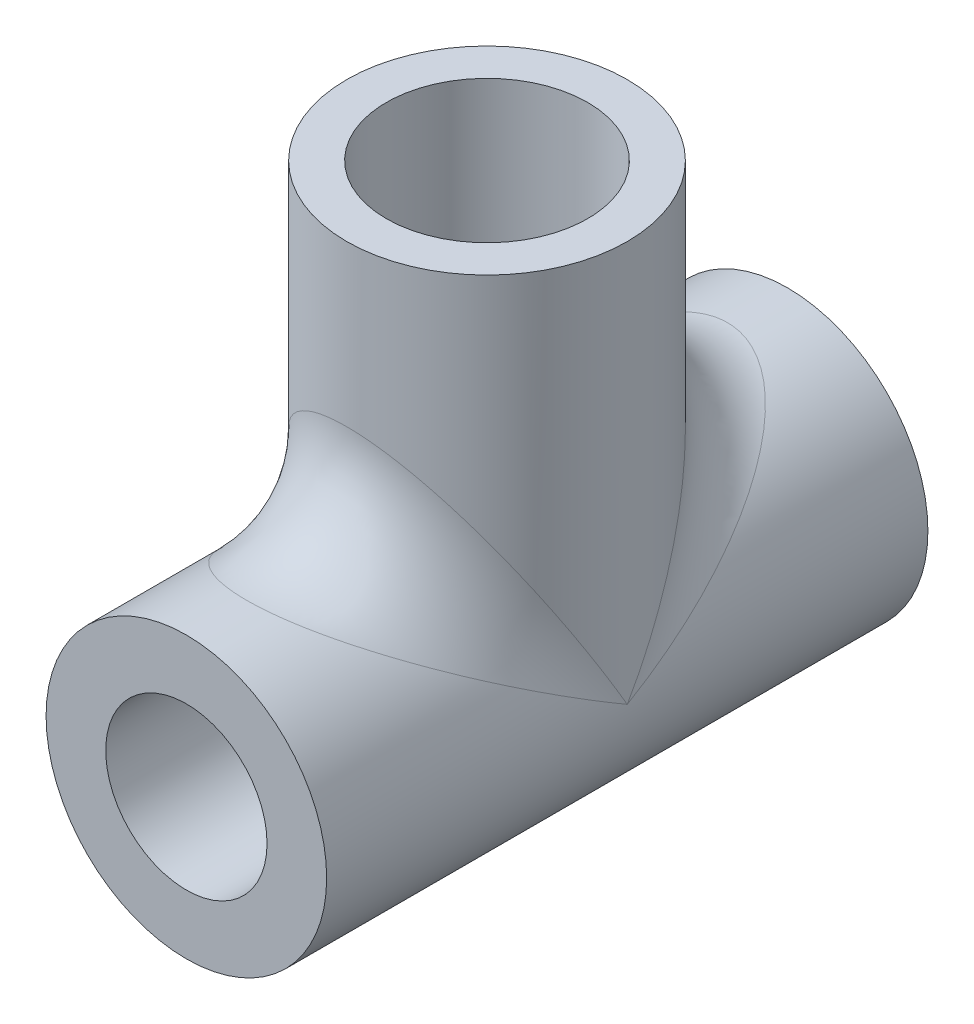
ISO-10303-21;
HEADER;
FILE_DESCRIPTION(('STEP AP214'),'2;1');
FILE_NAME('part.step','',(''),(''),'','','');
FILE_SCHEMA(('AUTOMOTIVE_DESIGN { 1 0 10303 214 1 1 1 1 }'));
ENDSEC;
DATA;
#1=APPLICATION_CONTEXT('core data for automotive mechanical design processes');
#2=APPLICATION_PROTOCOL_DEFINITION('international standard','automotive_design',2000,#1);
#3=PRODUCT_CONTEXT('',#1,'mechanical');
#4=PRODUCT('Part','Part','',(#3));
#5=PRODUCT_RELATED_PRODUCT_CATEGORY('part','',(#4));
#6=PRODUCT_DEFINITION_FORMATION('','',#4);
#7=PRODUCT_DEFINITION_CONTEXT('part definition',#1,'design');
#8=PRODUCT_DEFINITION('design','',#6,#7);
#9=PRODUCT_DEFINITION_SHAPE('','',#8);
#10=(LENGTH_UNIT() NAMED_UNIT(*) SI_UNIT(.MILLI.,.METRE.));
#11=(NAMED_UNIT(*) PLANE_ANGLE_UNIT() SI_UNIT($,.RADIAN.));
#12=(NAMED_UNIT(*) SI_UNIT($,.STERADIAN.) SOLID_ANGLE_UNIT());
#13=UNCERTAINTY_MEASURE_WITH_UNIT(LENGTH_MEASURE(1.E-05),#10,'distance_accuracy_value','');
#14=(GEOMETRIC_REPRESENTATION_CONTEXT(3) GLOBAL_UNCERTAINTY_ASSIGNED_CONTEXT((#13)) GLOBAL_UNIT_ASSIGNED_CONTEXT((#10,
#11,#12)) REPRESENTATION_CONTEXT('',''));
#15=CARTESIAN_POINT('',(0.,0.,0.));
#16=DIRECTION('',(0.,0.,1.));
#17=DIRECTION('',(1.,0.,0.));
#18=AXIS2_PLACEMENT_3D('',#15,#16,#17);
#19=CARTESIAN_POINT('',(0.,0.,30.));
#20=DIRECTION('',(0.,0.,-1.));
#21=DIRECTION('',(-1.,0.,0.));
#22=AXIS2_PLACEMENT_3D('',#19,#20,#21);
#23=CYLINDRICAL_SURFACE('',#22,7.);
#24=CARTESIAN_POINT('',(0.,0.,0.));
#25=DIRECTION('',(0.,0.,1.));
#26=DIRECTION('',(1.,0.,0.));
#27=AXIS2_PLACEMENT_3D('',#24,#25,#26);
#28=CIRCLE('',#27,7.);
#29=CARTESIAN_POINT('',(7.,0.,0.));
#30=VERTEX_POINT('',#29);
#31=EDGE_CURVE('E80',#30,#30,#28,.T.);
#32=ORIENTED_EDGE('',*,*,#31,.T.);
#33=EDGE_LOOP('',(#32));
#34=FACE_BOUND('',#33,.T.);
#35=CARTESIAN_POINT('',(0.,0.,30.));
#36=DIRECTION('',(0.,0.,1.));
#37=DIRECTION('',(1.,0.,0.));
#38=AXIS2_PLACEMENT_3D('',#35,#36,#37);
#39=CIRCLE('',#38,7.);
#40=CARTESIAN_POINT('',(7.,0.,30.));
#41=VERTEX_POINT('',#40);
#42=EDGE_CURVE('E76',#41,#41,#39,.T.);
#43=ORIENTED_EDGE('',*,*,#42,.F.);
#44=EDGE_LOOP('',(#43));
#45=FACE_BOUND('',#44,.T.);
#46=CARTESIAN_POINT('',(0.,0.,15.));
#47=DIRECTION('',(0.,0.863778900898433,0.503871025524086));
#48=DIRECTION('',(0.,-0.503871025524086,0.863778900898433));
#49=AXIS2_PLACEMENT_3D('',#46,#47,#48);
#50=ELLIPSE('',#49,13.8924439894498,7.);
#51=CARTESIAN_POINT('',(-7.,0.,15.));
#52=VERTEX_POINT('',#51);
#53=CARTESIAN_POINT('',(7.,0.,15.));
#54=VERTEX_POINT('',#53);
#55=EDGE_CURVE('E53',#52,#54,#50,.F.);
#56=ORIENTED_EDGE('',*,*,#55,.T.);
#57=CARTESIAN_POINT('',(0.,0.,15.));
#58=DIRECTION('',(0.,0.863778900898433,-0.503871025524086));
#59=DIRECTION('',(0.,-0.503871025524086,-0.863778900898433));
#60=AXIS2_PLACEMENT_3D('',#57,#58,#59);
#61=ELLIPSE('',#60,13.8924439894498,7.);
#62=EDGE_CURVE('E11',#54,#52,#61,.F.);
#63=ORIENTED_EDGE('',*,*,#62,.T.);
#64=EDGE_LOOP('',(#56,#63));
#65=FACE_BOUND('',#64,.T.);
#66=ADVANCED_FACE('F39',(#34,#45,#65),#23,.T.);
#67=CARTESIAN_POINT('',(0.,0.,30.));
#68=DIRECTION('',(0.,0.,1.));
#69=DIRECTION('',(1.,0.,0.));
#70=AXIS2_PLACEMENT_3D('',#67,#68,#69);
#71=PLANE('',#70);
#72=CARTESIAN_POINT('',(0.,0.,30.));
#73=DIRECTION('',(0.,0.,1.));
#74=DIRECTION('',(1.,0.,0.));
#75=AXIS2_PLACEMENT_3D('',#72,#73,#74);
#76=CIRCLE('',#75,4.025);
#77=CARTESIAN_POINT('',(4.025,0.,30.));
#78=VERTEX_POINT('',#77);
#79=EDGE_CURVE('E134',#78,#78,#76,.T.);
#80=ORIENTED_EDGE('',*,*,#79,.F.);
#81=EDGE_LOOP('',(#80));
#82=FACE_BOUND('',#81,.T.);
#83=ORIENTED_EDGE('',*,*,#42,.T.);
#84=EDGE_LOOP('',(#83));
#85=FACE_BOUND('',#84,.T.);
#86=ADVANCED_FACE('F98',(#82,#85),#71,.T.);
#87=CARTESIAN_POINT('',(0.,0.,0.));
#88=DIRECTION('',(0.,0.,1.));
#89=DIRECTION('',(1.,0.,0.));
#90=AXIS2_PLACEMENT_3D('',#87,#88,#89);
#91=PLANE('',#90);
#92=CARTESIAN_POINT('',(0.,0.,0.));
#93=DIRECTION('',(0.,0.,1.));
#94=DIRECTION('',(1.,0.,0.));
#95=AXIS2_PLACEMENT_3D('',#92,#93,#94);
#96=CIRCLE('',#95,4.025);
#97=CARTESIAN_POINT('',(4.025,0.,0.));
#98=VERTEX_POINT('',#97);
#99=EDGE_CURVE('E132',#98,#98,#96,.T.);
#100=ORIENTED_EDGE('',*,*,#99,.T.);
#101=EDGE_LOOP('',(#100));
#102=FACE_BOUND('',#101,.T.);
#103=ORIENTED_EDGE('',*,*,#31,.F.);
#104=EDGE_LOOP('',(#103));
#105=FACE_BOUND('',#104,.T.);
#106=ADVANCED_FACE('F95',(#102,#105),#91,.F.);
#107=CARTESIAN_POINT('',(0.,20.,15.));
#108=DIRECTION('',(0.,-1.,0.));
#109=DIRECTION('',(0.,0.,-1.));
#110=AXIS2_PLACEMENT_3D('',#107,#108,#109);
#111=CYLINDRICAL_SURFACE('',#110,7.);
#112=CARTESIAN_POINT('',(0.,20.,15.));
#113=DIRECTION('',(0.,1.,0.));
#114=DIRECTION('',(0.,0.,1.));
#115=AXIS2_PLACEMENT_3D('',#112,#113,#114);
#116=CIRCLE('',#115,7.);
#117=CARTESIAN_POINT('',(0.,20.,22.));
#118=VERTEX_POINT('',#117);
#119=EDGE_CURVE('E118',#118,#118,#116,.T.);
#120=ORIENTED_EDGE('',*,*,#119,.F.);
#121=EDGE_LOOP('',(#120));
#122=FACE_BOUND('',#121,.T.);
#123=CARTESIAN_POINT('',(0.,0.,15.));
#124=DIRECTION('',(0.,0.503871025524086,0.863778900898433));
#125=DIRECTION('',(0.,-0.863778900898433,0.503871025524086));
#126=AXIS2_PLACEMENT_3D('',#123,#124,#125);
#127=ELLIPSE('',#126,13.8924439894498,7.);
#128=EDGE_CURVE('E72',#54,#52,#127,.T.);
#129=ORIENTED_EDGE('',*,*,#128,.T.);
#130=CARTESIAN_POINT('',(0.,0.,15.));
#131=DIRECTION('',(0.,0.503871025524086,-0.863778900898433));
#132=DIRECTION('',(0.,-0.863778900898433,-0.503871025524086));
#133=AXIS2_PLACEMENT_3D('',#130,#131,#132);
#134=ELLIPSE('',#133,13.8924439894498,7.);
#135=EDGE_CURVE('E65',#52,#54,#134,.T.);
#136=ORIENTED_EDGE('',*,*,#135,.T.);
#137=EDGE_LOOP('',(#129,#136));
#138=FACE_BOUND('',#137,.T.);
#139=ADVANCED_FACE('F71',(#122,#138),#111,.T.);
#140=CARTESIAN_POINT('',(0.,20.,15.));
#141=DIRECTION('',(0.,1.,0.));
#142=DIRECTION('',(0.,0.,1.));
#143=AXIS2_PLACEMENT_3D('',#140,#141,#142);
#144=PLANE('',#143);
#145=CARTESIAN_POINT('',(0.,20.,15.));
#146=DIRECTION('',(0.,1.,0.));
#147=DIRECTION('',(0.,0.,1.));
#148=AXIS2_PLACEMENT_3D('',#145,#146,#147);
#149=CIRCLE('',#148,5.025);
#150=CARTESIAN_POINT('',(0.,20.,20.025));
#151=VERTEX_POINT('',#150);
#152=EDGE_CURVE('E127',#151,#151,#149,.T.);
#153=ORIENTED_EDGE('',*,*,#152,.F.);
#154=EDGE_LOOP('',(#153));
#155=FACE_BOUND('',#154,.T.);
#156=ORIENTED_EDGE('',*,*,#119,.T.);
#157=EDGE_LOOP('',(#156));
#158=FACE_BOUND('',#157,.T.);
#159=ADVANCED_FACE('F94',(#155,#158),#144,.T.);
#160=CARTESIAN_POINT('',(0.,8.,15.));
#161=DIRECTION('',(0.,1.,0.));
#162=DIRECTION('',(0.,0.,1.));
#163=AXIS2_PLACEMENT_3D('',#160,#161,#162);
#164=CYLINDRICAL_SURFACE('',#163,5.025);
#165=CARTESIAN_POINT('',(0.,8.,15.));
#166=DIRECTION('',(0.,1.,0.));
#167=DIRECTION('',(0.,0.,1.));
#168=AXIS2_PLACEMENT_3D('',#165,#166,#167);
#169=CIRCLE('',#168,5.025);
#170=CARTESIAN_POINT('',(0.,8.,20.025));
#171=VERTEX_POINT('',#170);
#172=EDGE_CURVE('E121',#171,#171,#169,.T.);
#173=ORIENTED_EDGE('',*,*,#172,.F.);
#174=EDGE_LOOP('',(#173));
#175=FACE_BOUND('',#174,.T.);
#176=ORIENTED_EDGE('',*,*,#152,.T.);
#177=EDGE_LOOP('',(#176));
#178=FACE_BOUND('',#177,.T.);
#179=ADVANCED_FACE('F149',(#175,#178),#164,.F.);
#180=CARTESIAN_POINT('',(0.,8.,15.));
#181=DIRECTION('',(0.,1.,0.));
#182=DIRECTION('',(0.,0.,1.));
#183=AXIS2_PLACEMENT_3D('',#180,#181,#182);
#184=PLANE('',#183);
#185=ORIENTED_EDGE('',*,*,#172,.T.);
#186=EDGE_LOOP('',(#185));
#187=FACE_BOUND('',#186,.T.);
#188=ADVANCED_FACE('F143',(#187),#184,.T.);
#189=CARTESIAN_POINT('',(0.,0.,0.));
#190=DIRECTION('',(0.,0.,1.));
#191=DIRECTION('',(1.,0.,0.));
#192=AXIS2_PLACEMENT_3D('',#189,#190,#191);
#193=CYLINDRICAL_SURFACE('',#192,4.025);
#194=ORIENTED_EDGE('',*,*,#99,.F.);
#195=EDGE_LOOP('',(#194));
#196=FACE_BOUND('',#195,.T.);
#197=ORIENTED_EDGE('',*,*,#79,.T.);
#198=EDGE_LOOP('',(#197));
#199=FACE_BOUND('',#198,.T.);
#200=ADVANCED_FACE('F87',(#196,#199),#193,.F.);
#201=CARTESIAN_POINT('',(7.,0.,15.));
#202=CARTESIAN_POINT('',(6.99999999999999,0.,15.));
#203=CARTESIAN_POINT('',(7.,0.,15.));
#204=CARTESIAN_POINT('',(6.99999121671173,0.152507156184433,15.2614408391733));
#205=CARTESIAN_POINT('',(7.00002568373421,0.206973635544794,15.2069736355447));
#206=CARTESIAN_POINT('',(6.99999121671173,0.26144083917334,15.1525071561844));
#207=CARTESIAN_POINT('',(6.99501618814987,0.304992315298513,15.5228439690831));
#208=CARTESIAN_POINT('',(6.99144768642064,0.414064677169837,15.4140646771698));
#209=CARTESIAN_POINT('',(6.99501618814987,0.522843969083195,15.3049923152985));
#210=CARTESIAN_POINT('',(6.97507447764639,0.609647938849697,16.0451107523137));
#211=CARTESIAN_POINT('',(6.95727769866295,0.826828213524044,15.826828213524));
#212=CARTESIAN_POINT('',(6.97507447764639,1.04511075231379,15.6096479388497));
#213=CARTESIAN_POINT('',(6.96010696220212,0.761818375972701,16.3059743588103));
#214=CARTESIAN_POINT('',(6.93163564044578,1.03279285488625,16.0327928548862));
#215=CARTESIAN_POINT('',(6.96010696220211,1.30597435881035,15.7618183759727));
#216=CARTESIAN_POINT('',(6.90048035637649,1.21473805848717,17.0824081002637));
#217=CARTESIAN_POINT('',(6.82960943420147,1.64413006224257,16.6441300622426));
#218=CARTESIAN_POINT('',(6.90048035637648,2.0824081002637,16.2147380584872));
#219=CARTESIAN_POINT('',(6.84109756250271,1.51459233066843,17.5964439954316));
#220=CARTESIAN_POINT('',(6.72779723667562,2.04660139397045,17.0466013939705));
#221=CARTESIAN_POINT('',(6.8410975625027,2.5964439954316,16.5145923306684));
#222=CARTESIAN_POINT('',(6.68319941414075,2.10389036856832,18.60666920326));
#223=CARTESIAN_POINT('',(6.46118137855605,2.82392092414324,17.8239209241432));
#224=CARTESIAN_POINT('',(6.68319941414075,3.60666920325998,17.1038903685683));
#225=CARTESIAN_POINT('',(6.58535713458826,2.39342439063523,19.103013241089));
#226=CARTESIAN_POINT('',(6.29598987161912,3.20108723741113,18.2010872374111));
#227=CARTESIAN_POINT('',(6.58535713458825,4.10301324108896,17.3934243906352));
#228=CARTESIAN_POINT('',(6.35186811595102,2.95711400081162,20.0693382871056));
#229=CARTESIAN_POINT('',(5.90998492766348,3.91574935643684,18.9157493564368));
#230=CARTESIAN_POINT('',(6.35186811595101,5.06933828710563,17.9571140008116));
#231=CARTESIAN_POINT('',(6.21721204272844,3.23147272262579,20.5396675245014));
#232=CARTESIAN_POINT('',(5.68859612985308,4.25548875426844,19.2554887542684));
#233=CARTESIAN_POINT('',(6.21721204272843,5.53966752450136,18.2314727226258));
#234=CARTESIAN_POINT('',(5.91207835949009,3.75998003658355,21.4456800627146));
#235=CARTESIAN_POINT('',(5.20120692093714,4.88398143428298,19.883981434283));
#236=CARTESIAN_POINT('',(5.91207835949009,6.44568006271465,18.7599800365836));
#237=CARTESIAN_POINT('',(5.74287737854464,4.01449395109674,21.8819896304515));
#238=CARTESIAN_POINT('',(4.93446890750515,5.17484438858528,20.1748443885853));
#239=CARTESIAN_POINT('',(5.74287737854463,6.8819896304515,19.0144939510967));
#240=CARTESIAN_POINT('',(5.37126551204024,4.49878788197021,22.7122077976633));
#241=CARTESIAN_POINT('',(4.37171373632647,5.69598508355168,20.6959850835517));
#242=CARTESIAN_POINT('',(5.37126551204024,7.71220779766327,19.4987878819702));
#243=CARTESIAN_POINT('',(5.17036063103307,4.72914023348076,23.10709754311));
#244=CARTESIAN_POINT('',(4.07485694126246,5.9281576183475,20.9281576183475));
#245=CARTESIAN_POINT('',(5.17036063103307,8.10709754311004,19.7291402334808));
#246=CARTESIAN_POINT('',(4.7385328939594,5.1609563672913,23.8473537724992));
#247=CARTESIAN_POINT('',(3.47197474466876,6.32548689216347,21.3254868921635));
#248=CARTESIAN_POINT('',(4.7385328939594,8.8473537724992,20.1609563672913));
#249=CARTESIAN_POINT('',(4.50925349768859,5.36323278803965,24.1941133509245));
#250=CARTESIAN_POINT('',(3.16511722736772,6.49223435553789,21.4922343555379));
#251=CARTESIAN_POINT('',(4.50925349768859,9.19411335092452,20.3632327880397));
#252=CARTESIAN_POINT('',(4.02455018659784,5.73516303189859,24.8317080546839));
#253=CARTESIAN_POINT('',(2.56651938800386,6.75781641350634,21.7578164135063));
#254=CARTESIAN_POINT('',(4.02455018659784,9.83170805468386,20.7351630318986));
#255=CARTESIAN_POINT('',(3.77076463640556,5.90587451263537,25.124356307377));
#256=CARTESIAN_POINT('',(2.27411762563465,6.8578636695983,21.8578636695983));
#257=CARTESIAN_POINT('',(3.77076463640555,10.124356307377,20.9058745126354));
#258=CARTESIAN_POINT('',(3.24119344694015,6.21157814119922,25.6484196706252));
#259=CARTESIAN_POINT('',(1.72994171137987,6.99750115059274,21.9975011505927));
#260=CARTESIAN_POINT('',(3.24119344694014,10.6484196706252,21.2115781411992));
#261=CARTESIAN_POINT('',(2.96687442345336,6.3478148345062,25.8819682877177));
#262=CARTESIAN_POINT('',(1.47784832893888,7.03790856640037,22.0379085664004));
#263=CARTESIAN_POINT('',(2.96687442345336,10.8819682877177,21.3478148345062));
#264=CARTESIAN_POINT('',(2.54025494045971,6.52454261603055,26.184930198913));
#265=CARTESIAN_POINT('',(1.14446342953702,7.06672093085115,22.0667209308512));
#266=CARTESIAN_POINT('',(2.54025494045971,11.184930198913,21.5245426160305));
#267=CARTESIAN_POINT('',(2.39854164490027,6.57802209796876,26.2766093108134));
#268=CARTESIAN_POINT('',(1.04174687131263,7.07111091747496,22.071110917475));
#269=CARTESIAN_POINT('',(2.39854164490027,11.2766093108134,21.5780220979688));
#270=CARTESIAN_POINT('',(2.10929959814391,6.67638725753668,26.4452352986433));
#271=CARTESIAN_POINT('',(0.849988565968583,7.07265552979389,22.0726555297939));
#272=CARTESIAN_POINT('',(2.10929959814391,11.4452352986433,21.6763872575367));
#273=CARTESIAN_POINT('',(1.96177369987319,6.7212770892842,26.5221892959176));
#274=CARTESIAN_POINT('',(0.761262199215204,7.06972424789233,22.0697242478923));
#275=CARTESIAN_POINT('',(1.96177369987319,11.5221892959176,21.7212770892842));
#276=CARTESIAN_POINT('',(1.66614295579844,6.80049208368201,26.6579864291674));
#277=CARTESIAN_POINT('',(0.600591803470876,7.05976112109474,22.0597611210947));
#278=CARTESIAN_POINT('',(1.66614295579844,11.6579864291674,21.800492083682));
#279=CARTESIAN_POINT('',(1.51818505161996,6.83509109499208,26.7172990199879));
#280=CARTESIAN_POINT('',(0.528502499356465,7.05282034418533,22.0528203441853));
#281=CARTESIAN_POINT('',(1.51818505161996,11.7172990199879,21.8350910949921));
#282=CARTESIAN_POINT('',(1.21848462757332,6.89482656928182,26.8197026902001));
#283=CARTESIAN_POINT('',(0.396761079941371,7.03798411921859,22.0379841192186));
#284=CARTESIAN_POINT('',(1.21848462757332,11.8197026902001,21.8948265692818));
#285=CARTESIAN_POINT('',(1.06674227762967,6.9199634563054,26.8627944965241));
#286=CARTESIAN_POINT('',(0.337365547459925,7.0300985450055,22.0300985450055));
#287=CARTESIAN_POINT('',(1.06674227762967,11.8627944965241,21.9199634563054));
#288=CARTESIAN_POINT('',(0.763120646237779,6.9599359679304,26.9313188021658));
#289=CARTESIAN_POINT('',(0.229058918336639,7.01628835912518,22.0162883591252));
#290=CARTESIAN_POINT('',(0.763120646237778,11.9313188021658,21.9599359679304));
#291=CARTESIAN_POINT('',(0.611283958786551,6.97493290949336,26.957027844846));
#292=CARTESIAN_POINT('',(0.180181199355022,7.01036129285114,22.0103612928511));
#293=CARTESIAN_POINT('',(0.61128395878655,11.957027844846,21.9749329094934));
#294=CARTESIAN_POINT('',(0.306298165295676,6.9949648369347,26.9913682918886));
#295=CARTESIAN_POINT('',(0.0874601589115753,7.0022061370351,22.0022061370351));
#296=CARTESIAN_POINT('',(0.306298165295675,11.9913682918886,21.9949648369347));
#297=CARTESIAN_POINT('',(0.153149082647838,7.,27.));
#298=CARTESIAN_POINT('',(0.0437616029125144,7.,22.));
#299=CARTESIAN_POINT('',(0.153149082647837,12.,22.));
#300=CARTESIAN_POINT('',(-0.153149082647838,7.,27.));
#301=CARTESIAN_POINT('',(-0.0437616029125174,7.,22.));
#302=CARTESIAN_POINT('',(-0.15314908264784,12.,22.));
#303=CARTESIAN_POINT('',(-0.306298165295677,6.9949648369347,26.9913682918886));
#304=CARTESIAN_POINT('',(-0.0874601589115785,7.0022061370351,22.0022061370351));
#305=CARTESIAN_POINT('',(-0.306298165295678,11.9913682918886,21.9949648369347));
#306=CARTESIAN_POINT('',(-0.611283958786552,6.97493290949336,26.957027844846));
#307=CARTESIAN_POINT('',(-0.180181199355026,7.01036129285114,22.0103612928511));
#308=CARTESIAN_POINT('',(-0.611283958786553,11.957027844846,21.9749329094934));
#309=CARTESIAN_POINT('',(-0.76312064623778,6.9599359679304,26.9313188021658));
#310=CARTESIAN_POINT('',(-0.229058918336641,7.01628835912518,22.0162883591252));
#311=CARTESIAN_POINT('',(-0.763120646237781,11.9313188021658,21.9599359679304));
#312=CARTESIAN_POINT('',(-1.06674227762967,6.9199634563054,26.8627944965241));
#313=CARTESIAN_POINT('',(-0.337365547459927,7.0300985450055,22.0300985450055));
#314=CARTESIAN_POINT('',(-1.06674227762967,11.8627944965241,21.9199634563054));
#315=CARTESIAN_POINT('',(-1.21848462757332,6.89482656928182,26.8197026902001));
#316=CARTESIAN_POINT('',(-0.396761079941374,7.03798411921859,22.0379841192186));
#317=CARTESIAN_POINT('',(-1.21848462757332,11.8197026902001,21.8948265692818));
#318=CARTESIAN_POINT('',(-1.51818505161996,6.83509109499208,26.7172990199879));
#319=CARTESIAN_POINT('',(-0.528502499356468,7.05282034418533,22.0528203441853));
#320=CARTESIAN_POINT('',(-1.51818505161996,11.7172990199879,21.8350910949921));
#321=CARTESIAN_POINT('',(-1.66614295579844,6.80049208368202,26.6579864291674));
#322=CARTESIAN_POINT('',(-0.600591803470879,7.05976112109474,22.0597611210947));
#323=CARTESIAN_POINT('',(-1.66614295579844,11.6579864291674,21.800492083682));
#324=CARTESIAN_POINT('',(-1.96177369987319,6.7212770892842,26.5221892959176));
#325=CARTESIAN_POINT('',(-0.761262199215206,7.06972424789234,22.0697242478923));
#326=CARTESIAN_POINT('',(-1.96177369987319,11.5221892959176,21.7212770892842));
#327=CARTESIAN_POINT('',(-2.10929959814391,6.67638725753668,26.4452352986433));
#328=CARTESIAN_POINT('',(-0.849988565968585,7.07265552979389,22.0726555297939));
#329=CARTESIAN_POINT('',(-2.10929959814391,11.4452352986433,21.6763872575367));
#330=CARTESIAN_POINT('',(-2.39854164490027,6.57802209796876,26.2766093108134));
#331=CARTESIAN_POINT('',(-1.04174687131263,7.07111091747495,22.071110917475));
#332=CARTESIAN_POINT('',(-2.39854164490027,11.2766093108134,21.5780220979688));
#333=CARTESIAN_POINT('',(-2.54025494045971,6.52454261603055,26.184930198913));
#334=CARTESIAN_POINT('',(-1.14446342953703,7.06672093085116,22.0667209308512));
#335=CARTESIAN_POINT('',(-2.54025494045971,11.184930198913,21.5245426160305));
#336=CARTESIAN_POINT('',(-2.96687442345336,6.3478148345062,25.8819682877177));
#337=CARTESIAN_POINT('',(-1.47784832893888,7.03790856640037,22.0379085664004));
#338=CARTESIAN_POINT('',(-2.96687442345336,10.8819682877177,21.3478148345062));
#339=CARTESIAN_POINT('',(-3.24119344694015,6.21157814119922,25.6484196706252));
#340=CARTESIAN_POINT('',(-1.72994171137987,6.99750115059274,21.9975011505927));
#341=CARTESIAN_POINT('',(-3.24119344694015,10.6484196706252,21.2115781411992));
#342=CARTESIAN_POINT('',(-3.77076463640556,5.90587451263537,25.124356307377));
#343=CARTESIAN_POINT('',(-2.27411762563465,6.8578636695983,21.8578636695983));
#344=CARTESIAN_POINT('',(-3.77076463640556,10.124356307377,20.9058745126354));
#345=CARTESIAN_POINT('',(-4.02455018659784,5.73516303189859,24.8317080546839));
#346=CARTESIAN_POINT('',(-2.56651938800386,6.75781641350634,21.7578164135063));
#347=CARTESIAN_POINT('',(-4.02455018659785,9.83170805468386,20.7351630318986));
#348=CARTESIAN_POINT('',(-4.50925349768859,5.36323278803965,24.1941133509245));
#349=CARTESIAN_POINT('',(-3.16511722736772,6.4922343555379,21.4922343555379));
#350=CARTESIAN_POINT('',(-4.50925349768859,9.19411335092452,20.3632327880397));
#351=CARTESIAN_POINT('',(-4.7385328939594,5.1609563672913,23.8473537724992));
#352=CARTESIAN_POINT('',(-3.47197474466876,6.32548689216347,21.3254868921635));
#353=CARTESIAN_POINT('',(-4.73853289395941,8.84735377249921,20.1609563672913));
#354=CARTESIAN_POINT('',(-5.17036063103307,4.72914023348076,23.10709754311));
#355=CARTESIAN_POINT('',(-4.07485694126246,5.92815761834751,20.9281576183475));
#356=CARTESIAN_POINT('',(-5.17036063103307,8.10709754311004,19.7291402334808));
#357=CARTESIAN_POINT('',(-5.37126551204024,4.49878788197021,22.7122077976633));
#358=CARTESIAN_POINT('',(-4.37171373632647,5.69598508355169,20.6959850835517));
#359=CARTESIAN_POINT('',(-5.37126551204024,7.71220779766327,19.4987878819702));
#360=CARTESIAN_POINT('',(-5.74287737854464,4.01449395109674,21.8819896304515));
#361=CARTESIAN_POINT('',(-4.93446890750515,5.17484438858528,20.1748443885853));
#362=CARTESIAN_POINT('',(-5.74287737854464,6.88198963045151,19.0144939510967));
#363=CARTESIAN_POINT('',(-5.91207835949009,3.75998003658356,21.4456800627147));
#364=CARTESIAN_POINT('',(-5.20120692093714,4.88398143428298,19.883981434283));
#365=CARTESIAN_POINT('',(-5.91207835949009,6.44568006271465,18.7599800365836));
#366=CARTESIAN_POINT('',(-6.21721204272844,3.23147272262579,20.5396675245014));
#367=CARTESIAN_POINT('',(-5.68859612985308,4.25548875426844,19.2554887542684));
#368=CARTESIAN_POINT('',(-6.21721204272844,5.53966752450137,18.2314727226258));
#369=CARTESIAN_POINT('',(-6.35186811595102,2.95711400081162,20.0693382871056));
#370=CARTESIAN_POINT('',(-5.90998492766348,3.91574935643685,18.9157493564368));
#371=CARTESIAN_POINT('',(-6.35186811595102,5.06933828710564,17.9571140008116));
#372=CARTESIAN_POINT('',(-6.58535713458826,2.39342439063523,19.103013241089));
#373=CARTESIAN_POINT('',(-6.29598987161912,3.20108723741113,18.2010872374111));
#374=CARTESIAN_POINT('',(-6.58535713458826,4.10301324108896,17.3934243906352));
#375=CARTESIAN_POINT('',(-6.68319941414075,2.10389036856831,18.60666920326));
#376=CARTESIAN_POINT('',(-6.46118137855605,2.82392092414323,17.8239209241432));
#377=CARTESIAN_POINT('',(-6.68319941414075,3.60666920325997,17.1038903685683));
#378=CARTESIAN_POINT('',(-6.84109756250271,1.51459233066844,17.5964439954316));
#379=CARTESIAN_POINT('',(-6.72779723667563,2.04660139397046,17.0466013939705));
#380=CARTESIAN_POINT('',(-6.84109756250271,2.59644399543161,16.5145923306684));
#381=CARTESIAN_POINT('',(-6.90048035637649,1.21473805848719,17.0824081002637));
#382=CARTESIAN_POINT('',(-6.82960943420147,1.6441300622426,16.6441300622426));
#383=CARTESIAN_POINT('',(-6.90048035637649,2.08240810026374,16.2147380584872));
#384=CARTESIAN_POINT('',(-6.96010696220212,0.761818375972689,16.3059743588103));
#385=CARTESIAN_POINT('',(-6.93163564044578,1.03279285488623,16.0327928548862));
#386=CARTESIAN_POINT('',(-6.96010696220212,1.30597435881033,15.7618183759727));
#387=CARTESIAN_POINT('',(-6.97507447764639,0.609647938849665,16.0451107523138));
#388=CARTESIAN_POINT('',(-6.95727769866295,0.826828213524001,15.826828213524));
#389=CARTESIAN_POINT('',(-6.97507447764639,1.04511075231373,15.6096479388497));
#390=CARTESIAN_POINT('',(-6.99501618814987,0.304992315298467,15.5228439690832));
#391=CARTESIAN_POINT('',(-6.99144768642065,0.414064677169776,15.4140646771698));
#392=CARTESIAN_POINT('',(-6.99501618814987,0.522843969083116,15.3049923152985));
#393=CARTESIAN_POINT('',(-6.99999121671173,0.152507156184394,15.2614408391733));
#394=CARTESIAN_POINT('',(-7.00002568373422,0.206973635544741,15.2069736355448));
#395=CARTESIAN_POINT('',(-6.99999121671173,0.261440839173273,15.1525071561844));
#396=CARTESIAN_POINT('',(-7.,0.,15.));
#397=CARTESIAN_POINT('',(-7.,0.,15.));
#398=CARTESIAN_POINT('',(-7.,0.,15.));
#399=(BOUNDED_SURFACE() B_SPLINE_SURFACE(3,2,((#201,#202,#203),(#204,#205,#206),(#207,#208,
#209),(#210,#211,#212),(#213,#214,#215),(#216,#217,#218),(#219,#220,#221),(#222,#223,#224),
(#225,#226,#227),(#228,#229,#230),(#231,#232,#233),(#234,#235,#236),(#237,#238,#239),(#240,#241,
#242),(#243,#244,#245),(#246,#247,#248),(#249,#250,#251),(#252,#253,#254),(#255,#256,#257),
(#258,#259,#260),(#261,#262,#263),(#264,#265,#266),(#267,#268,#269),(#270,#271,#272),(#273,#274,
#275),(#276,#277,#278),(#279,#280,#281),(#282,#283,#284),(#285,#286,#287),(#288,#289,#290),
(#291,#292,#293),(#294,#295,#296),(#297,#298,#299),(#300,#301,#302),(#303,#304,#305),(#306,#307,
#308),(#309,#310,#311),(#312,#313,#314),(#315,#316,#317),(#318,#319,#320),(#321,#322,#323),
(#324,#325,#326),(#327,#328,#329),(#330,#331,#332),(#333,#334,#335),(#336,#337,#338),(#339,#340,
#341),(#342,#343,#344),(#345,#346,#347),(#348,#349,#350),(#351,#352,#353),(#354,#355,#356),
(#357,#358,#359),(#360,#361,#362),(#363,#364,#365),(#366,#367,#368),(#369,#370,#371),(#372,#373,
#374),(#375,#376,#377),(#378,#379,#380),(#381,#382,#383),(#384,#385,#386),(#387,#388,#389),
(#390,#391,#392),(#393,#394,#395),(#396,#397,#398)),.UNSPECIFIED.,.F.,.F.,
.F.) B_SPLINE_SURFACE_WITH_KNOTS((4,2,2,2,2,2,2,2,2,2,2,2,2,2,2,2,2,2,2,2,2,2,2,2,2,2,2,2,2,2,2,
2,4),(3,3),(0.,1.1089923560654,2.21807722799634,4.41670953078066,6.57846427416409,
8.68696549975972,10.728352993526,12.6921809693986,14.5723457106401,16.3680007090523,
18.0843521750083,18.9096646552528,19.7345769843153,20.5350233679069,21.3354338753221,
22.1227905156799,22.9101331514558,23.6974757872317,24.4848324275894,25.2852429350046,
26.0856893185962,26.9106016476587,27.7359141279032,29.4522655938593,31.2479205922714,
33.128085333513,35.0919133093856,37.1333008031518,39.2418020287475,41.4035567721309,
43.6021890749152,44.7112739468461,45.8202663029115),(0.,1.),
.UNSPECIFIED.) GEOMETRIC_REPRESENTATION_ITEM() RATIONAL_B_SPLINE_SURFACE(((1.,1.,1.),(1.,
0.999999961347463,1.),(1.,0.999643922983415,1.),(1.,0.998220838244432,1.),(1.,0.9971537325573,
1.),(1.,0.992912442828985,1.),(1.,0.988698139291655,1.),(1.,0.977616678491385,1.),(1.,
0.97079520304151,1.),(1.,0.954789243872577,1.),(1.,0.945667111065233,1.),(1.,0.925487928481846,
1.),(1.,0.914501709356166,1.),(1.,0.891170043426741,1.),(1.,0.878892097180268,1.),(1.,
0.853706858801671,1.),(1.,0.840848661881578,1.),(1.,0.815387916751879,1.),(1.,0.802799855398148,
1.),(1.,0.778879121387154,1.),(1.,0.767515558221761,1.),(1.,0.752114039499013,1.),(1.,
0.747335652339599,1.),(1.,0.738380805978003,1.),(1.,0.734204056055491,1.),(1.,0.726721566717485,
1.),(1.,0.723393668203355,1.),(1.,0.717585877218612,1.),(1.,0.715105946746874,1.),(1.,
0.711136411789176,1.),(1.,0.709631315728964,1.),(1.,0.707616509279792,1.),(1.,0.707106781186548,
1.),(1.,0.707106781186548,1.),(1.,0.707616509279792,1.),(1.,0.709631315728964,1.),(1.,
0.711136411789176,1.),(1.,0.715105946746874,1.),(1.,0.717585877218612,1.),(1.,0.723393668203355,
1.),(1.,0.726721566717485,1.),(1.,0.734204056055491,1.),(1.,0.738380805978003,1.),(1.,
0.747335652339599,1.),(1.,0.752114039499013,1.),(1.,0.767515558221761,1.),(1.,0.778879121387154,
1.),(1.,0.802799855398147,1.),(1.,0.815387916751879,1.),(1.,0.840848661881577,1.),(1.,
0.853706858801671,1.),(1.,0.878892097180268,1.),(1.,0.891170043426741,1.),(1.,0.914501709356166,
1.),(1.,0.925487928481845,1.),(1.,0.945667111065232,1.),(1.,0.954789243872577,1.),(1.,
0.97079520304151,1.),(1.,0.977616678491385,1.),(1.,0.988698139291655,1.),(1.,0.992912442828985,
1.),(1.,0.9971537325573,1.),(1.,0.998220838244432,1.),(1.,0.999643922983415,1.),(1.,
0.999999961347463,1.),(1.,1.,1.))) REPRESENTATION_ITEM('') SURFACE());
#400=ORIENTED_EDGE('',*,*,#135,.F.);
#401=ORIENTED_EDGE('',*,*,#62,.F.);
#402=EDGE_LOOP('',(#400,#401));
#403=FACE_BOUND('',#402,.T.);
#404=ADVANCED_FACE('F63',(#403),#399,.F.);
#405=CARTESIAN_POINT('',(-7.,0.,15.));
#406=CARTESIAN_POINT('',(-7.,0.,15.));
#407=CARTESIAN_POINT('',(-7.,0.,15.));
#408=CARTESIAN_POINT('',(-6.99999121671173,0.152507156184393,14.7385591608267));
#409=CARTESIAN_POINT('',(-7.00002568373422,0.206973635544739,14.7930263644552));
#410=CARTESIAN_POINT('',(-6.99999121671173,0.261440839173271,14.8474928438156));
#411=CARTESIAN_POINT('',(-6.99501618814987,0.304992315298467,14.4771560309168));
#412=CARTESIAN_POINT('',(-6.99144768642065,0.414064677169776,14.5859353228302));
#413=CARTESIAN_POINT('',(-6.99501618814987,0.522843969083116,14.6950076847015));
#414=CARTESIAN_POINT('',(-6.97507447764639,0.609647938849666,13.9548892476862));
#415=CARTESIAN_POINT('',(-6.95727769866295,0.826828213524002,14.173171786476));
#416=CARTESIAN_POINT('',(-6.97507447764639,1.04511075231373,14.3903520611503));
#417=CARTESIAN_POINT('',(-6.96010696220212,0.76181837597269,13.6940256411897));
#418=CARTESIAN_POINT('',(-6.93163564044578,1.03279285488623,13.9672071451138));
#419=CARTESIAN_POINT('',(-6.96010696220212,1.30597435881033,14.2381816240273));
#420=CARTESIAN_POINT('',(-6.90048035637649,1.21473805848719,12.9175918997363));
#421=CARTESIAN_POINT('',(-6.82960943420147,1.6441300622426,13.3558699377574));
#422=CARTESIAN_POINT('',(-6.90048035637649,2.08240810026374,13.7852619415128));
#423=CARTESIAN_POINT('',(-6.84109756250271,1.51459233066844,12.4035560045684));
#424=CARTESIAN_POINT('',(-6.72779723667563,2.04660139397046,12.9533986060295));
#425=CARTESIAN_POINT('',(-6.84109756250271,2.59644399543161,13.4854076693316));
#426=CARTESIAN_POINT('',(-6.68319941414075,2.10389036856831,11.39333079674));
#427=CARTESIAN_POINT('',(-6.46118137855605,2.82392092414323,12.1760790758568));
#428=CARTESIAN_POINT('',(-6.68319941414075,3.60666920325997,12.8961096314317));
#429=CARTESIAN_POINT('',(-6.58535713458826,2.39342439063523,10.896986758911));
#430=CARTESIAN_POINT('',(-6.29598987161912,3.20108723741113,11.7989127625889));
#431=CARTESIAN_POINT('',(-6.58535713458826,4.10301324108896,12.6065756093648));
#432=CARTESIAN_POINT('',(-6.35186811595102,2.95711400081162,9.93066171289437));
#433=CARTESIAN_POINT('',(-5.90998492766348,3.91574935643684,11.0842506435632));
#434=CARTESIAN_POINT('',(-6.35186811595102,5.06933828710564,12.0428859991884));
#435=CARTESIAN_POINT('',(-6.21721204272844,3.23147272262579,9.46033247549864));
#436=CARTESIAN_POINT('',(-5.68859612985308,4.25548875426844,10.7445112457316));
#437=CARTESIAN_POINT('',(-6.21721204272844,5.53966752450136,11.7685272773742));
#438=CARTESIAN_POINT('',(-5.91207835949009,3.75998003658355,8.55431993728535));
#439=CARTESIAN_POINT('',(-5.20120692093715,4.88398143428298,10.116018565717));
#440=CARTESIAN_POINT('',(-5.91207835949009,6.44568006271465,11.2400199634164));
#441=CARTESIAN_POINT('',(-5.74287737854464,4.01449395109674,8.11801036954849));
#442=CARTESIAN_POINT('',(-4.93446890750516,5.17484438858528,9.82515561141472));
#443=CARTESIAN_POINT('',(-5.74287737854464,6.8819896304515,10.9855060489033));
#444=CARTESIAN_POINT('',(-5.37126551204024,4.49878788197021,7.28779220233673));
#445=CARTESIAN_POINT('',(-4.37171373632648,5.69598508355169,9.30401491644832));
#446=CARTESIAN_POINT('',(-5.37126551204024,7.71220779766327,10.5012121180298));
#447=CARTESIAN_POINT('',(-5.17036063103307,4.72914023348076,6.89290245688996));
#448=CARTESIAN_POINT('',(-4.07485694126246,5.9281576183475,9.0718423816525));
#449=CARTESIAN_POINT('',(-5.17036063103307,8.10709754311004,10.2708597665192));
#450=CARTESIAN_POINT('',(-4.73853289395941,5.1609563672913,6.1526462275008));
#451=CARTESIAN_POINT('',(-3.47197474466876,6.32548689216347,8.67451310783653));
#452=CARTESIAN_POINT('',(-4.73853289395941,8.8473537724992,9.8390436327087));
#453=CARTESIAN_POINT('',(-4.50925349768859,5.36323278803965,5.80588664907548));
#454=CARTESIAN_POINT('',(-3.16511722736773,6.4922343555379,8.5077656444621));
#455=CARTESIAN_POINT('',(-4.5092534976886,9.19411335092452,9.63676721196035));
#456=CARTESIAN_POINT('',(-4.02455018659785,5.73516303189859,5.16829194531614));
#457=CARTESIAN_POINT('',(-2.56651938800386,6.75781641350634,8.24218358649366));
#458=CARTESIAN_POINT('',(-4.02455018659785,9.83170805468386,9.26483696810141));
#459=CARTESIAN_POINT('',(-3.77076463640556,5.90587451263537,4.87564369262301));
#460=CARTESIAN_POINT('',(-2.27411762563466,6.8578636695983,8.1421363304017));
#461=CARTESIAN_POINT('',(-3.77076463640556,10.124356307377,9.09412548736463));
#462=CARTESIAN_POINT('',(-3.24119344694015,6.21157814119921,4.35158032937475));
#463=CARTESIAN_POINT('',(-1.72994171137987,6.99750115059274,8.00249884940726));
#464=CARTESIAN_POINT('',(-3.24119344694015,10.6484196706252,8.78842185880078));
#465=CARTESIAN_POINT('',(-2.96687442345336,6.3478148345062,4.11803171228231));
#466=CARTESIAN_POINT('',(-1.47784832893889,7.03790856640037,7.96209143359962));
#467=CARTESIAN_POINT('',(-2.96687442345336,10.8819682877177,8.6521851654938));
#468=CARTESIAN_POINT('',(-2.54025494045971,6.52454261603055,3.81506980108702));
#469=CARTESIAN_POINT('',(-1.14446342953703,7.06672093085115,7.93327906914885));
#470=CARTESIAN_POINT('',(-2.54025494045971,11.184930198913,8.47545738396945));
#471=CARTESIAN_POINT('',(-2.39854164490027,6.57802209796876,3.72339068918659));
#472=CARTESIAN_POINT('',(-1.04174687131263,7.07111091747496,7.92888908252505));
#473=CARTESIAN_POINT('',(-2.39854164490027,11.2766093108134,8.42197790203124));
#474=CARTESIAN_POINT('',(-2.10929959814391,6.67638725753668,3.55476470135668));
#475=CARTESIAN_POINT('',(-0.849988565968586,7.07265552979389,7.92734447020611));
#476=CARTESIAN_POINT('',(-2.10929959814391,11.4452352986433,8.32361274246332));
#477=CARTESIAN_POINT('',(-1.96177369987319,6.7212770892842,3.47781070408241));
#478=CARTESIAN_POINT('',(-0.761262199215207,7.06972424789233,7.93027575210767));
#479=CARTESIAN_POINT('',(-1.96177369987319,11.5221892959176,8.2787229107158));
#480=CARTESIAN_POINT('',(-1.66614295579844,6.80049208368201,3.34201357083261));
#481=CARTESIAN_POINT('',(-0.60059180347088,7.05976112109474,7.94023887890526));
#482=CARTESIAN_POINT('',(-1.66614295579844,11.6579864291674,8.19950791631798));
#483=CARTESIAN_POINT('',(-1.51818505161996,6.83509109499208,3.2827009800121));
#484=CARTESIAN_POINT('',(-0.528502499356469,7.05282034418533,7.94717965581467));
#485=CARTESIAN_POINT('',(-1.51818505161996,11.7172990199879,8.16490890500792));
#486=CARTESIAN_POINT('',(-1.21848462757332,6.89482656928182,3.18029730979995));
#487=CARTESIAN_POINT('',(-0.396761079941375,7.03798411921859,7.96201588078141));
#488=CARTESIAN_POINT('',(-1.21848462757333,11.8197026902001,8.10517343071818));
#489=CARTESIAN_POINT('',(-1.06674227762967,6.9199634563054,3.13720550347587));
#490=CARTESIAN_POINT('',(-0.337365547459929,7.0300985450055,7.9699014549945));
#491=CARTESIAN_POINT('',(-1.06674227762967,11.8627944965241,8.0800365436946));
#492=CARTESIAN_POINT('',(-0.763120646237781,6.9599359679304,3.06868119783417));
#493=CARTESIAN_POINT('',(-0.229058918336642,7.01628835912518,7.98371164087482));
#494=CARTESIAN_POINT('',(-0.763120646237783,11.9313188021658,8.0400640320696));
#495=CARTESIAN_POINT('',(-0.611283958786553,6.97493290949336,3.04297215515395));
#496=CARTESIAN_POINT('',(-0.180181199355026,7.01036129285114,7.98963870714886));
#497=CARTESIAN_POINT('',(-0.611283958786555,11.957027844846,8.02506709050664));
#498=CARTESIAN_POINT('',(-0.306298165295678,6.9949648369347,3.00863170811136));
#499=CARTESIAN_POINT('',(-0.0874601589115788,7.0022061370351,7.9977938629649));
#500=CARTESIAN_POINT('',(-0.30629816529568,11.9913682918886,8.0050351630653));
#501=CARTESIAN_POINT('',(-0.15314908264784,7.,3.));
#502=CARTESIAN_POINT('',(-0.0437616029125178,7.,8.));
#503=CARTESIAN_POINT('',(-0.153149082647842,12.,8.));
#504=CARTESIAN_POINT('',(0.153149082647836,7.,3.));
#505=CARTESIAN_POINT('',(0.0437616029125139,7.,8.));
#506=CARTESIAN_POINT('',(0.153149082647835,12.,8.));
#507=CARTESIAN_POINT('',(0.306298165295675,6.9949648369347,3.00863170811136));
#508=CARTESIAN_POINT('',(0.087460158911575,7.0022061370351,7.9977938629649));
#509=CARTESIAN_POINT('',(0.306298165295673,11.9913682918886,8.0050351630653));
#510=CARTESIAN_POINT('',(0.611283958786549,6.97493290949336,3.04297215515395));
#511=CARTESIAN_POINT('',(0.180181199355022,7.01036129285114,7.98963870714886));
#512=CARTESIAN_POINT('',(0.611283958786548,11.957027844846,8.02506709050664));
#513=CARTESIAN_POINT('',(0.763120646237778,6.9599359679304,3.06868119783417));
#514=CARTESIAN_POINT('',(0.229058918336638,7.01628835912518,7.98371164087482));
#515=CARTESIAN_POINT('',(0.763120646237776,11.9313188021658,8.0400640320696));
#516=CARTESIAN_POINT('',(1.06674227762967,6.9199634563054,3.13720550347587));
#517=CARTESIAN_POINT('',(0.337365547459924,7.0300985450055,7.9699014549945));
#518=CARTESIAN_POINT('',(1.06674227762967,11.8627944965241,8.0800365436946));
#519=CARTESIAN_POINT('',(1.21848462757332,6.89482656928182,3.18029730979995));
#520=CARTESIAN_POINT('',(0.39676107994137,7.03798411921859,7.96201588078141));
#521=CARTESIAN_POINT('',(1.21848462757332,11.8197026902001,8.10517343071818));
#522=CARTESIAN_POINT('',(1.51818505161996,6.83509109499208,3.2827009800121));
#523=CARTESIAN_POINT('',(0.528502499356465,7.05282034418533,7.94717965581467));
#524=CARTESIAN_POINT('',(1.51818505161995,11.7172990199879,8.16490890500792));
#525=CARTESIAN_POINT('',(1.66614295579844,6.80049208368202,3.34201357083261));
#526=CARTESIAN_POINT('',(0.600591803470875,7.05976112109474,7.94023887890526));
#527=CARTESIAN_POINT('',(1.66614295579844,11.6579864291674,8.19950791631798));
#528=CARTESIAN_POINT('',(1.96177369987319,6.7212770892842,3.4778107040824));
#529=CARTESIAN_POINT('',(0.761262199215203,7.06972424789233,7.93027575210766));
#530=CARTESIAN_POINT('',(1.96177369987319,11.5221892959176,8.2787229107158));
#531=CARTESIAN_POINT('',(2.1092995981439,6.67638725753669,3.55476470135668));
#532=CARTESIAN_POINT('',(0.849988565968581,7.07265552979389,7.92734447020611));
#533=CARTESIAN_POINT('',(2.1092995981439,11.4452352986433,8.32361274246331));
#534=CARTESIAN_POINT('',(2.39854164490027,6.57802209796876,3.72339068918659));
#535=CARTESIAN_POINT('',(1.04174687131263,7.07111091747496,7.92888908252505));
#536=CARTESIAN_POINT('',(2.39854164490027,11.2766093108134,8.42197790203124));
#537=CARTESIAN_POINT('',(2.54025494045971,6.52454261603055,3.81506980108702));
#538=CARTESIAN_POINT('',(1.14446342953702,7.06672093085115,7.93327906914885));
#539=CARTESIAN_POINT('',(2.54025494045971,11.184930198913,8.47545738396945));
#540=CARTESIAN_POINT('',(2.96687442345336,6.3478148345062,4.11803171228231));
#541=CARTESIAN_POINT('',(1.47784832893888,7.03790856640037,7.96209143359963));
#542=CARTESIAN_POINT('',(2.96687442345336,10.8819682877177,8.6521851654938));
#543=CARTESIAN_POINT('',(3.24119344694014,6.21157814119922,4.35158032937475));
#544=CARTESIAN_POINT('',(1.72994171137987,6.99750115059274,8.00249884940726));
#545=CARTESIAN_POINT('',(3.24119344694014,10.6484196706252,8.78842185880078));
#546=CARTESIAN_POINT('',(3.77076463640555,5.90587451263537,4.87564369262301));
#547=CARTESIAN_POINT('',(2.27411762563465,6.8578636695983,8.1421363304017));
#548=CARTESIAN_POINT('',(3.77076463640555,10.124356307377,9.09412548736463));
#549=CARTESIAN_POINT('',(4.02455018659784,5.73516303189859,5.16829194531614));
#550=CARTESIAN_POINT('',(2.56651938800385,6.75781641350634,8.24218358649366));
#551=CARTESIAN_POINT('',(4.02455018659784,9.83170805468386,9.26483696810141));
#552=CARTESIAN_POINT('',(4.50925349768859,5.36323278803965,5.80588664907548));
#553=CARTESIAN_POINT('',(3.16511722736772,6.49223435553789,8.5077656444621));
#554=CARTESIAN_POINT('',(4.50925349768859,9.19411335092452,9.63676721196035));
#555=CARTESIAN_POINT('',(4.7385328939594,5.1609563672913,6.15264622750079));
#556=CARTESIAN_POINT('',(3.47197474466875,6.32548689216347,8.67451310783653));
#557=CARTESIAN_POINT('',(4.7385328939594,8.84735377249921,9.8390436327087));
#558=CARTESIAN_POINT('',(5.17036063103307,4.72914023348076,6.89290245688996));
#559=CARTESIAN_POINT('',(4.07485694126246,5.92815761834751,9.07184238165249));
#560=CARTESIAN_POINT('',(5.17036063103306,8.10709754311004,10.2708597665192));
#561=CARTESIAN_POINT('',(5.37126551204024,4.49878788197022,7.28779220233673));
#562=CARTESIAN_POINT('',(4.37171373632647,5.69598508355169,9.30401491644831));
#563=CARTESIAN_POINT('',(5.37126551204024,7.71220779766327,10.5012121180298));
#564=CARTESIAN_POINT('',(5.74287737854463,4.01449395109674,8.11801036954849));
#565=CARTESIAN_POINT('',(4.93446890750515,5.17484438858528,9.82515561141472));
#566=CARTESIAN_POINT('',(5.74287737854463,6.88198963045151,10.9855060489033));
#567=CARTESIAN_POINT('',(5.91207835949009,3.75998003658356,8.55431993728535));
#568=CARTESIAN_POINT('',(5.20120692093714,4.88398143428298,10.116018565717));
#569=CARTESIAN_POINT('',(5.91207835949009,6.44568006271466,11.2400199634164));
#570=CARTESIAN_POINT('',(6.21721204272844,3.23147272262579,9.46033247549863));
#571=CARTESIAN_POINT('',(5.68859612985308,4.25548875426844,10.7445112457316));
#572=CARTESIAN_POINT('',(6.21721204272843,5.53966752450137,11.7685272773742));
#573=CARTESIAN_POINT('',(6.35186811595102,2.95711400081162,9.93066171289436));
#574=CARTESIAN_POINT('',(5.90998492766348,3.91574935643684,11.0842506435632));
#575=CARTESIAN_POINT('',(6.35186811595101,5.06933828710564,12.0428859991884));
#576=CARTESIAN_POINT('',(6.58535713458826,2.39342439063523,10.896986758911));
#577=CARTESIAN_POINT('',(6.29598987161912,3.20108723741113,11.7989127625889));
#578=CARTESIAN_POINT('',(6.58535713458825,4.10301324108896,12.6065756093648));
#579=CARTESIAN_POINT('',(6.68319941414075,2.10389036856832,11.39333079674));
#580=CARTESIAN_POINT('',(6.46118137855605,2.82392092414324,12.1760790758568));
#581=CARTESIAN_POINT('',(6.68319941414074,3.60666920325998,12.8961096314317));
#582=CARTESIAN_POINT('',(6.84109756250271,1.51459233066843,12.4035560045684));
#583=CARTESIAN_POINT('',(6.72779723667562,2.04660139397045,12.9533986060295));
#584=CARTESIAN_POINT('',(6.8410975625027,2.5964439954316,13.4854076693316));
#585=CARTESIAN_POINT('',(6.90048035637649,1.21473805848717,12.9175918997363));
#586=CARTESIAN_POINT('',(6.82960943420147,1.64413006224257,13.3558699377574));
#587=CARTESIAN_POINT('',(6.90048035637648,2.0824081002637,13.7852619415128));
#588=CARTESIAN_POINT('',(6.96010696220212,0.761818375972701,13.6940256411897));
#589=CARTESIAN_POINT('',(6.93163564044578,1.03279285488625,13.9672071451138));
#590=CARTESIAN_POINT('',(6.96010696220211,1.30597435881035,14.2381816240273));
#591=CARTESIAN_POINT('',(6.97507447764639,0.609647938849697,13.9548892476863));
#592=CARTESIAN_POINT('',(6.95727769866295,0.826828213524044,14.173171786476));
#593=CARTESIAN_POINT('',(6.97507447764639,1.04511075231379,14.3903520611503));
#594=CARTESIAN_POINT('',(6.99501618814987,0.304992315298514,14.4771560309169));
#595=CARTESIAN_POINT('',(6.99144768642064,0.41406467716984,14.5859353228302));
#596=CARTESIAN_POINT('',(6.99501618814987,0.522843969083197,14.6950076847015));
#597=CARTESIAN_POINT('',(6.99999121671173,0.152507156184435,14.7385591608267));
#598=CARTESIAN_POINT('',(7.00002568373421,0.206973635544797,14.7930263644553));
#599=CARTESIAN_POINT('',(6.99999121671173,0.261440839173344,14.8474928438156));
#600=CARTESIAN_POINT('',(7.,0.,15.));
#601=CARTESIAN_POINT('',(6.99999999999999,0.,15.));
#602=CARTESIAN_POINT('',(7.,0.,15.));
#603=(BOUNDED_SURFACE() B_SPLINE_SURFACE(3,2,((#405,#406,#407),(#408,#409,#410),(#411,#412,
#413),(#414,#415,#416),(#417,#418,#419),(#420,#421,#422),(#423,#424,#425),(#426,#427,#428),
(#429,#430,#431),(#432,#433,#434),(#435,#436,#437),(#438,#439,#440),(#441,#442,#443),(#444,#445,
#446),(#447,#448,#449),(#450,#451,#452),(#453,#454,#455),(#456,#457,#458),(#459,#460,#461),
(#462,#463,#464),(#465,#466,#467),(#468,#469,#470),(#471,#472,#473),(#474,#475,#476),(#477,#478,
#479),(#480,#481,#482),(#483,#484,#485),(#486,#487,#488),(#489,#490,#491),(#492,#493,#494),
(#495,#496,#497),(#498,#499,#500),(#501,#502,#503),(#504,#505,#506),(#507,#508,#509),(#510,#511,
#512),(#513,#514,#515),(#516,#517,#518),(#519,#520,#521),(#522,#523,#524),(#525,#526,#527),
(#528,#529,#530),(#531,#532,#533),(#534,#535,#536),(#537,#538,#539),(#540,#541,#542),(#543,#544,
#545),(#546,#547,#548),(#549,#550,#551),(#552,#553,#554),(#555,#556,#557),(#558,#559,#560),
(#561,#562,#563),(#564,#565,#566),(#567,#568,#569),(#570,#571,#572),(#573,#574,#575),(#576,#577,
#578),(#579,#580,#581),(#582,#583,#584),(#585,#586,#587),(#588,#589,#590),(#591,#592,#593),
(#594,#595,#596),(#597,#598,#599),(#600,#601,#602)),.UNSPECIFIED.,.F.,.F.,
.F.) B_SPLINE_SURFACE_WITH_KNOTS((4,2,2,2,2,2,2,2,2,2,2,2,2,2,2,2,2,2,2,2,2,2,2,2,2,2,2,2,2,2,2,
2,4),(3,3),(0.,1.1089923560654,2.21807722799634,4.41670953078066,6.57846427416409,
8.68696549975972,10.728352993526,12.6921809693986,14.5723457106401,16.3680007090523,
18.0843521750083,18.9096646552528,19.7345769843153,20.5350233679069,21.3354338753221,
22.1227905156799,22.9101331514558,23.6974757872317,24.4848324275894,25.2852429350046,
26.0856893185962,26.9106016476587,27.7359141279032,29.4522655938593,31.2479205922714,
33.1280853335129,35.0919133093855,37.1333008031518,39.2418020287475,41.4035567721309,
43.6021890749152,44.7112739468461,45.8202663029115),(0.,1.),
.UNSPECIFIED.) GEOMETRIC_REPRESENTATION_ITEM() RATIONAL_B_SPLINE_SURFACE(((1.,1.,1.),(1.,
0.999999961347463,1.),(1.,0.999643922983415,1.),(1.,0.998220838244432,1.),(1.,0.9971537325573,
1.),(1.,0.992912442828985,1.),(1.,0.988698139291655,1.),(1.,0.977616678491385,1.),(1.,
0.97079520304151,1.),(1.,0.954789243872577,1.),(1.,0.945667111065233,1.),(1.,0.925487928481846,
1.),(1.,0.914501709356166,1.),(1.,0.891170043426741,1.),(1.,0.878892097180268,1.),(1.,
0.853706858801671,1.),(1.,0.840848661881578,1.),(1.,0.815387916751879,1.),(1.,0.802799855398148,
1.),(1.,0.778879121387154,1.),(1.,0.767515558221762,1.),(1.,0.752114039499013,1.),(1.,
0.747335652339599,1.),(1.,0.738380805978003,1.),(1.,0.734204056055491,1.),(1.,0.726721566717485,
1.),(1.,0.723393668203355,1.),(1.,0.717585877218612,1.),(1.,0.715105946746874,1.),(1.,
0.711136411789176,1.),(1.,0.709631315728964,1.),(1.,0.707616509279792,1.),(1.,0.707106781186548,
1.),(1.,0.707106781186548,1.),(1.,0.707616509279792,1.),(1.,0.709631315728964,1.),(1.,
0.711136411789176,1.),(1.,0.715105946746874,1.),(1.,0.717585877218612,1.),(1.,0.723393668203355,
1.),(1.,0.726721566717485,1.),(1.,0.734204056055491,1.),(1.,0.738380805978003,1.),(1.,
0.747335652339599,1.),(1.,0.752114039499013,1.),(1.,0.767515558221761,1.),(1.,0.778879121387154,
1.),(1.,0.802799855398148,1.),(1.,0.815387916751879,1.),(1.,0.840848661881577,1.),(1.,
0.853706858801671,1.),(1.,0.878892097180268,1.),(1.,0.891170043426741,1.),(1.,0.914501709356166,
1.),(1.,0.925487928481845,1.),(1.,0.945667111065232,1.),(1.,0.954789243872577,1.),(1.,
0.97079520304151,1.),(1.,0.977616678491385,1.),(1.,0.988698139291655,1.),(1.,0.992912442828985,
1.),(1.,0.9971537325573,1.),(1.,0.998220838244432,1.),(1.,0.999643922983415,1.),(1.,
0.999999961347463,1.),(1.,1.,1.))) REPRESENTATION_ITEM('') SURFACE());
#604=ORIENTED_EDGE('',*,*,#128,.F.);
#605=ORIENTED_EDGE('',*,*,#55,.F.);
#606=EDGE_LOOP('',(#604,#605));
#607=FACE_BOUND('',#606,.T.);
#608=ADVANCED_FACE('F41',(#607),#603,.F.);
#609=CLOSED_SHELL('',(#66,#86,#106,#139,#159,#179,#188,#200,#404,#608));
#610=MANIFOLD_SOLID_BREP('B2',#609);
#611=ADVANCED_BREP_SHAPE_REPRESENTATION('',(#18,#610),#14);
#612=SHAPE_DEFINITION_REPRESENTATION(#9,#611);
ENDSEC;
END-ISO-10303-21;
